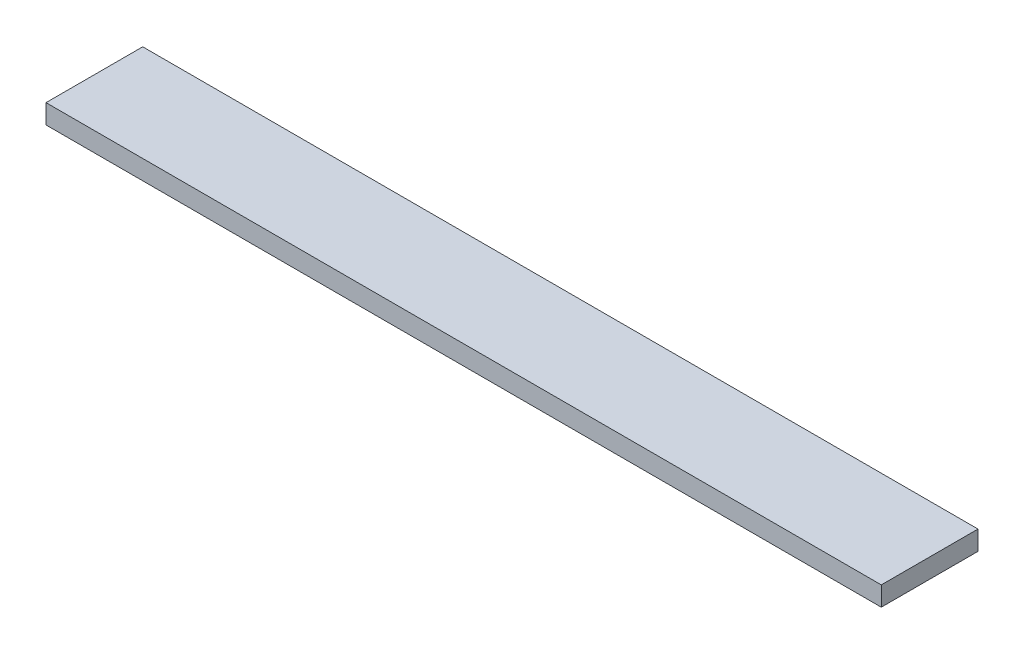
ISO-10303-21;
HEADER;
FILE_DESCRIPTION(('STEP AP214'),'2;1');
FILE_NAME('part.step','',(''),(''),'','','');
FILE_SCHEMA(('AUTOMOTIVE_DESIGN { 1 0 10303 214 1 1 1 1 }'));
ENDSEC;
DATA;
#1=APPLICATION_CONTEXT('core data for automotive mechanical design processes');
#2=APPLICATION_PROTOCOL_DEFINITION('international standard','automotive_design',2000,#1);
#3=PRODUCT_CONTEXT('',#1,'mechanical');
#4=PRODUCT('Part','Part','',(#3));
#5=PRODUCT_RELATED_PRODUCT_CATEGORY('part','',(#4));
#6=PRODUCT_DEFINITION_FORMATION('','',#4);
#7=PRODUCT_DEFINITION_CONTEXT('part definition',#1,'design');
#8=PRODUCT_DEFINITION('design','',#6,#7);
#9=PRODUCT_DEFINITION_SHAPE('','',#8);
#10=(LENGTH_UNIT() NAMED_UNIT(*) SI_UNIT(.MILLI.,.METRE.));
#11=(NAMED_UNIT(*) PLANE_ANGLE_UNIT() SI_UNIT($,.RADIAN.));
#12=(NAMED_UNIT(*) SI_UNIT($,.STERADIAN.) SOLID_ANGLE_UNIT());
#13=UNCERTAINTY_MEASURE_WITH_UNIT(LENGTH_MEASURE(1.E-05),#10,'distance_accuracy_value','');
#14=(GEOMETRIC_REPRESENTATION_CONTEXT(3) GLOBAL_UNCERTAINTY_ASSIGNED_CONTEXT((#13)) GLOBAL_UNIT_ASSIGNED_CONTEXT((#10,
#11,#12)) REPRESENTATION_CONTEXT('',''));
#15=CARTESIAN_POINT('',(0.,0.,0.));
#16=DIRECTION('',(0.,0.,1.));
#17=DIRECTION('',(1.,0.,0.));
#18=AXIS2_PLACEMENT_3D('',#15,#16,#17);
#19=CARTESIAN_POINT('',(0.,0.,25.));
#20=DIRECTION('',(-1.,0.,0.));
#21=DIRECTION('',(0.,-1.,0.));
#22=AXIS2_PLACEMENT_3D('',#19,#20,#21);
#23=PLANE('',#22);
#24=DIRECTION('',(0.,1.,0.));
#25=VECTOR('',#24,1.);
#26=CARTESIAN_POINT('',(0.,0.,0.));
#27=LINE('',#26,#25);
#28=CARTESIAN_POINT('',(0.,-5.,0.));
#29=VERTEX_POINT('',#28);
#30=CARTESIAN_POINT('',(0.,0.,0.));
#31=VERTEX_POINT('',#30);
#32=EDGE_CURVE('E97',#29,#31,#27,.T.);
#33=ORIENTED_EDGE('',*,*,#32,.T.);
#34=DIRECTION('',(0.,0.,-1.));
#35=VECTOR('',#34,1.);
#36=CARTESIAN_POINT('',(0.,0.,25.));
#37=LINE('',#36,#35);
#38=CARTESIAN_POINT('',(0.,0.,25.));
#39=VERTEX_POINT('',#38);
#40=EDGE_CURVE('E11',#39,#31,#37,.T.);
#41=ORIENTED_EDGE('',*,*,#40,.F.);
#42=DIRECTION('',(0.,1.,0.));
#43=VECTOR('',#42,1.);
#44=CARTESIAN_POINT('',(0.,0.,25.));
#45=LINE('',#44,#43);
#46=CARTESIAN_POINT('',(0.,-5.,25.));
#47=VERTEX_POINT('',#46);
#48=EDGE_CURVE('E85',#47,#39,#45,.T.);
#49=ORIENTED_EDGE('',*,*,#48,.F.);
#50=DIRECTION('',(0.,0.,-1.));
#51=VECTOR('',#50,1.);
#52=CARTESIAN_POINT('',(0.,-5.,25.));
#53=LINE('',#52,#51);
#54=EDGE_CURVE('E93',#47,#29,#53,.T.);
#55=ORIENTED_EDGE('',*,*,#54,.T.);
#56=EDGE_LOOP('',(#33,#41,#49,#55));
#57=FACE_BOUND('',#56,.T.);
#58=ADVANCED_FACE('F34',(#57),#23,.F.);
#59=CARTESIAN_POINT('',(0.,0.,25.));
#60=DIRECTION('',(0.,-1.,0.));
#61=DIRECTION('',(1.,0.,0.));
#62=AXIS2_PLACEMENT_3D('',#59,#60,#61);
#63=PLANE('',#62);
#64=DIRECTION('',(-1.,0.,0.));
#65=VECTOR('',#64,1.);
#66=CARTESIAN_POINT('',(0.,0.,0.));
#67=LINE('',#66,#65);
#68=CARTESIAN_POINT('',(-215.9,0.,0.));
#69=VERTEX_POINT('',#68);
#70=EDGE_CURVE('E89',#31,#69,#67,.T.);
#71=ORIENTED_EDGE('',*,*,#70,.T.);
#72=DIRECTION('',(0.,0.,-1.));
#73=VECTOR('',#72,1.);
#74=CARTESIAN_POINT('',(-215.9,0.,25.));
#75=LINE('',#74,#73);
#76=CARTESIAN_POINT('',(-215.9,0.,25.));
#77=VERTEX_POINT('',#76);
#78=EDGE_CURVE('E42',#77,#69,#75,.T.);
#79=ORIENTED_EDGE('',*,*,#78,.F.);
#80=DIRECTION('',(-1.,0.,0.));
#81=VECTOR('',#80,1.);
#82=CARTESIAN_POINT('',(0.,0.,25.));
#83=LINE('',#82,#81);
#84=EDGE_CURVE('E80',#39,#77,#83,.T.);
#85=ORIENTED_EDGE('',*,*,#84,.F.);
#86=ORIENTED_EDGE('',*,*,#40,.T.);
#87=EDGE_LOOP('',(#71,#79,#85,#86));
#88=FACE_BOUND('',#87,.T.);
#89=ADVANCED_FACE('F88',(#88),#63,.F.);
#90=CARTESIAN_POINT('',(-215.9,0.,25.));
#91=DIRECTION('',(1.,0.,0.));
#92=DIRECTION('',(0.,0.,-1.));
#93=AXIS2_PLACEMENT_3D('',#90,#91,#92);
#94=PLANE('',#93);
#95=DIRECTION('',(0.,-1.,0.));
#96=VECTOR('',#95,1.);
#97=CARTESIAN_POINT('',(-215.9,0.,0.));
#98=LINE('',#97,#96);
#99=CARTESIAN_POINT('',(-215.9,-5.00000000000003,0.));
#100=VERTEX_POINT('',#99);
#101=EDGE_CURVE('E67',#69,#100,#98,.T.);
#102=ORIENTED_EDGE('',*,*,#101,.T.);
#103=DIRECTION('',(0.,0.,-1.));
#104=VECTOR('',#103,1.);
#105=CARTESIAN_POINT('',(-215.9,-5.00000000000003,25.));
#106=LINE('',#105,#104);
#107=CARTESIAN_POINT('',(-215.9,-5.00000000000003,25.));
#108=VERTEX_POINT('',#107);
#109=EDGE_CURVE('E90',#108,#100,#106,.T.);
#110=ORIENTED_EDGE('',*,*,#109,.F.);
#111=DIRECTION('',(0.,-1.,0.));
#112=VECTOR('',#111,1.);
#113=CARTESIAN_POINT('',(-215.9,0.,25.));
#114=LINE('',#113,#112);
#115=EDGE_CURVE('E83',#77,#108,#114,.T.);
#116=ORIENTED_EDGE('',*,*,#115,.F.);
#117=ORIENTED_EDGE('',*,*,#78,.T.);
#118=EDGE_LOOP('',(#102,#110,#116,#117));
#119=FACE_BOUND('',#118,.T.);
#120=ADVANCED_FACE('F91',(#119),#94,.F.);
#121=CARTESIAN_POINT('',(0.,-5.,25.));
#122=DIRECTION('',(0.,1.,0.));
#123=DIRECTION('',(-1.,0.,0.));
#124=AXIS2_PLACEMENT_3D('',#121,#122,#123);
#125=PLANE('',#124);
#126=DIRECTION('',(1.,0.,0.));
#127=VECTOR('',#126,1.);
#128=CARTESIAN_POINT('',(0.,-5.,0.));
#129=LINE('',#128,#127);
#130=EDGE_CURVE('E73',#100,#29,#129,.T.);
#131=ORIENTED_EDGE('',*,*,#130,.T.);
#132=ORIENTED_EDGE('',*,*,#54,.F.);
#133=DIRECTION('',(1.,0.,0.));
#134=VECTOR('',#133,1.);
#135=CARTESIAN_POINT('',(0.,-5.,25.));
#136=LINE('',#135,#134);
#137=EDGE_CURVE('E50',#108,#47,#136,.T.);
#138=ORIENTED_EDGE('',*,*,#137,.F.);
#139=ORIENTED_EDGE('',*,*,#109,.T.);
#140=EDGE_LOOP('',(#131,#132,#138,#139));
#141=FACE_BOUND('',#140,.T.);
#142=ADVANCED_FACE('F104',(#141),#125,.F.);
#143=CARTESIAN_POINT('',(0.,0.,25.));
#144=DIRECTION('',(0.,0.,-1.));
#145=DIRECTION('',(-1.,0.,0.));
#146=AXIS2_PLACEMENT_3D('',#143,#144,#145);
#147=PLANE('',#146);
#148=ORIENTED_EDGE('',*,*,#48,.T.);
#149=ORIENTED_EDGE('',*,*,#84,.T.);
#150=ORIENTED_EDGE('',*,*,#115,.T.);
#151=ORIENTED_EDGE('',*,*,#137,.T.);
#152=EDGE_LOOP('',(#148,#149,#150,#151));
#153=FACE_BOUND('',#152,.T.);
#154=ADVANCED_FACE('F81',(#153),#147,.F.);
#155=CARTESIAN_POINT('',(0.,0.,0.));
#156=DIRECTION('',(0.,0.,-1.));
#157=DIRECTION('',(-1.,0.,0.));
#158=AXIS2_PLACEMENT_3D('',#155,#156,#157);
#159=PLANE('',#158);
#160=ORIENTED_EDGE('',*,*,#32,.F.);
#161=ORIENTED_EDGE('',*,*,#130,.F.);
#162=ORIENTED_EDGE('',*,*,#101,.F.);
#163=ORIENTED_EDGE('',*,*,#70,.F.);
#164=EDGE_LOOP('',(#160,#161,#162,#163));
#165=FACE_BOUND('',#164,.T.);
#166=ADVANCED_FACE('F107',(#165),#159,.T.);
#167=CLOSED_SHELL('',(#58,#89,#120,#142,#154,#166));
#168=MANIFOLD_SOLID_BREP('B2',#167);
#169=ADVANCED_BREP_SHAPE_REPRESENTATION('',(#18,#168),#14);
#170=SHAPE_DEFINITION_REPRESENTATION(#9,#169);
ENDSEC;
END-ISO-10303-21;
